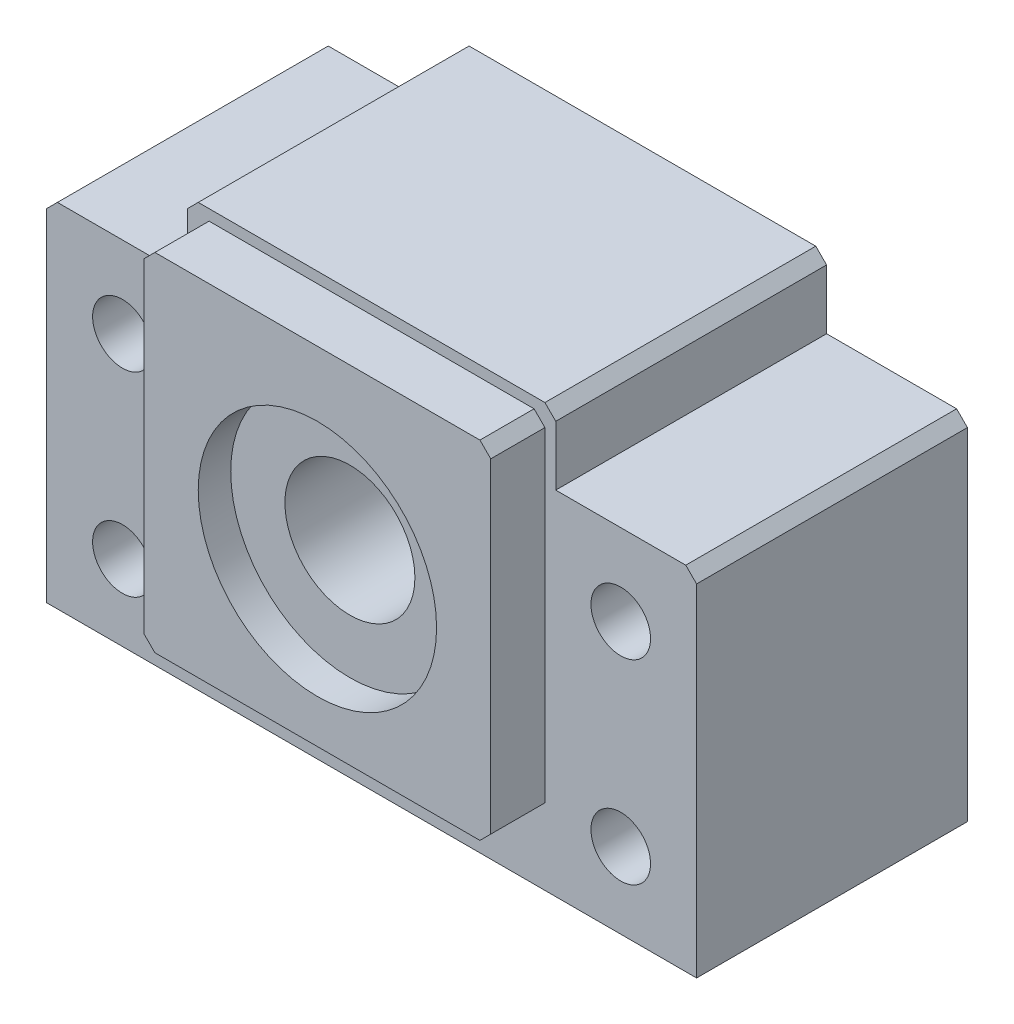
ISO-10303-21;
HEADER;
FILE_DESCRIPTION(('STEP AP214'),'2;1');
FILE_NAME('part.step','',(''),(''),'','','');
FILE_SCHEMA(('AUTOMOTIVE_DESIGN { 1 0 10303 214 1 1 1 1 }'));
ENDSEC;
DATA;
#1=APPLICATION_CONTEXT('core data for automotive mechanical design processes');
#2=APPLICATION_PROTOCOL_DEFINITION('international standard','automotive_design',2000,#1);
#3=PRODUCT_CONTEXT('',#1,'mechanical');
#4=PRODUCT('Part','Part','',(#3));
#5=PRODUCT_RELATED_PRODUCT_CATEGORY('part','',(#4));
#6=PRODUCT_DEFINITION_FORMATION('','',#4);
#7=PRODUCT_DEFINITION_CONTEXT('part definition',#1,'design');
#8=PRODUCT_DEFINITION('design','',#6,#7);
#9=PRODUCT_DEFINITION_SHAPE('','',#8);
#10=(LENGTH_UNIT() NAMED_UNIT(*) SI_UNIT(.MILLI.,.METRE.));
#11=(NAMED_UNIT(*) PLANE_ANGLE_UNIT() SI_UNIT($,.RADIAN.));
#12=(NAMED_UNIT(*) SI_UNIT($,.STERADIAN.) SOLID_ANGLE_UNIT());
#13=UNCERTAINTY_MEASURE_WITH_UNIT(LENGTH_MEASURE(1.E-05),#10,'distance_accuracy_value','');
#14=(GEOMETRIC_REPRESENTATION_CONTEXT(3) GLOBAL_UNCERTAINTY_ASSIGNED_CONTEXT((#13)) GLOBAL_UNIT_ASSIGNED_CONTEXT((#10,
#11,#12)) REPRESENTATION_CONTEXT('',''));
#15=CARTESIAN_POINT('',(0.,0.,0.));
#16=DIRECTION('',(0.,0.,1.));
#17=DIRECTION('',(1.,0.,0.));
#18=AXIS2_PLACEMENT_3D('',#15,#16,#17);
#19=CARTESIAN_POINT('',(0.,4.75,-12.5));
#20=DIRECTION('',(0.,0.,1.));
#21=DIRECTION('',(1.,0.,0.));
#22=AXIS2_PLACEMENT_3D('',#19,#20,#21);
#23=CYLINDRICAL_SURFACE('',#22,6.);
#24=CARTESIAN_POINT('',(0.,4.75,-12.5));
#25=DIRECTION('',(0.,0.,1.));
#26=DIRECTION('',(1.,0.,0.));
#27=AXIS2_PLACEMENT_3D('',#24,#25,#26);
#28=CIRCLE('',#27,6.);
#29=CARTESIAN_POINT('',(6.,4.75,-12.5));
#30=VERTEX_POINT('',#29);
#31=EDGE_CURVE('E649',#30,#30,#28,.T.);
#32=CARTESIAN_POINT('',(0.,4.75,14.5));
#33=DIRECTION('',(0.,0.,1.));
#34=DIRECTION('',(1.,0.,0.));
#35=AXIS2_PLACEMENT_3D('',#32,#33,#34);
#36=CIRCLE('',#35,6.);
#37=CARTESIAN_POINT('',(6.,4.75,14.5));
#38=VERTEX_POINT('',#37);
#39=EDGE_CURVE('E39',#38,#38,#36,.F.);
#40=CARTESIAN_POINT('',(6.,4.75,-12.5));
#41=CARTESIAN_POINT('',(6.,4.75,-12.21875));
#42=CARTESIAN_POINT('',(6.,4.75,-11.9375));
#43=CARTESIAN_POINT('',(6.,4.75,-11.375));
#44=CARTESIAN_POINT('',(6.,4.75,-11.09375));
#45=CARTESIAN_POINT('',(6.,4.75,-10.53125));
#46=CARTESIAN_POINT('',(6.,4.75,-10.25));
#47=CARTESIAN_POINT('',(6.,4.75,-9.6875));
#48=CARTESIAN_POINT('',(6.,4.75,-9.40625));
#49=CARTESIAN_POINT('',(6.,4.75,-8.84375));
#50=CARTESIAN_POINT('',(6.,4.75,-8.5625));
#51=CARTESIAN_POINT('',(6.,4.75,-8.));
#52=CARTESIAN_POINT('',(6.,4.75,-7.71875));
#53=CARTESIAN_POINT('',(6.,4.75,-7.15625));
#54=CARTESIAN_POINT('',(6.,4.75,-6.875));
#55=CARTESIAN_POINT('',(6.,4.75,-6.3125));
#56=CARTESIAN_POINT('',(6.,4.75,-6.03125));
#57=CARTESIAN_POINT('',(6.,4.75,-5.46875));
#58=CARTESIAN_POINT('',(6.,4.75,-5.1875));
#59=CARTESIAN_POINT('',(6.,4.75,-4.625));
#60=CARTESIAN_POINT('',(6.,4.75,-4.34375));
#61=CARTESIAN_POINT('',(6.,4.75,-3.78125));
#62=CARTESIAN_POINT('',(6.,4.75,-3.5));
#63=CARTESIAN_POINT('',(6.,4.75,-2.9375));
#64=CARTESIAN_POINT('',(6.,4.75,-2.65625));
#65=CARTESIAN_POINT('',(6.,4.75,-2.09375));
#66=CARTESIAN_POINT('',(6.,4.75,-1.8125));
#67=CARTESIAN_POINT('',(6.,4.75,-1.25));
#68=CARTESIAN_POINT('',(6.,4.75,-0.968750000000003));
#69=CARTESIAN_POINT('',(6.,4.75,-0.406250000000003));
#70=CARTESIAN_POINT('',(6.,4.75,-0.125000000000003));
#71=CARTESIAN_POINT('',(6.,4.75,0.437499999999997));
#72=CARTESIAN_POINT('',(6.,4.75,0.718749999999997));
#73=CARTESIAN_POINT('',(6.,4.75,1.28125));
#74=CARTESIAN_POINT('',(6.,4.75,1.5625));
#75=CARTESIAN_POINT('',(6.,4.75,2.125));
#76=CARTESIAN_POINT('',(6.,4.75,2.40625));
#77=CARTESIAN_POINT('',(6.,4.75,2.96875));
#78=CARTESIAN_POINT('',(6.,4.75,3.25));
#79=CARTESIAN_POINT('',(6.,4.75,3.8125));
#80=CARTESIAN_POINT('',(6.,4.75,4.09375));
#81=CARTESIAN_POINT('',(6.,4.75,4.65625));
#82=CARTESIAN_POINT('',(6.,4.75,4.9375));
#83=CARTESIAN_POINT('',(6.,4.75,5.5));
#84=CARTESIAN_POINT('',(6.,4.75,5.78125));
#85=CARTESIAN_POINT('',(6.,4.75,6.34375));
#86=CARTESIAN_POINT('',(6.,4.75,6.625));
#87=CARTESIAN_POINT('',(6.,4.75,7.1875));
#88=CARTESIAN_POINT('',(6.,4.75,7.46875));
#89=CARTESIAN_POINT('',(6.,4.75,8.03125));
#90=CARTESIAN_POINT('',(6.,4.75,8.3125));
#91=CARTESIAN_POINT('',(6.,4.75,8.875));
#92=CARTESIAN_POINT('',(6.,4.75,9.15625));
#93=CARTESIAN_POINT('',(6.,4.75,9.71875));
#94=CARTESIAN_POINT('',(6.,4.75,10.));
#95=CARTESIAN_POINT('',(6.,4.75,10.5625));
#96=CARTESIAN_POINT('',(6.,4.75,10.84375));
#97=CARTESIAN_POINT('',(6.,4.75,11.40625));
#98=CARTESIAN_POINT('',(6.,4.75,11.6875));
#99=CARTESIAN_POINT('',(6.,4.75,12.25));
#100=CARTESIAN_POINT('',(6.,4.75,12.53125));
#101=CARTESIAN_POINT('',(6.,4.75,13.09375));
#102=CARTESIAN_POINT('',(6.,4.75,13.375));
#103=CARTESIAN_POINT('',(6.,4.75,13.9375));
#104=CARTESIAN_POINT('',(6.,4.75,14.21875));
#105=CARTESIAN_POINT('',(6.,4.75,14.5));
#106=B_SPLINE_CURVE_WITH_KNOTS('',3,(#40,#41,#42,#43,#44,#45,#46,#47,#48,#49,#50,#51,#52,#53,
#54,#55,#56,#57,#58,#59,#60,#61,#62,#63,#64,#65,#66,#67,#68,#69,#70,#71,#72,#73,#74,#75,#76,#77,
#78,#79,#80,#81,#82,#83,#84,#85,#86,#87,#88,#89,#90,#91,#92,#93,#94,#95,#96,#97,#98,#99,#100,
#101,#102,#103,#104,#105),.UNSPECIFIED.,.F.,.F.,(4,2,2,2,2,2,2,2,2,2,2,2,2,2,2,2,2,2,2,2,2,2,2,
2,2,2,2,2,2,2,2,2,4),(0.,0.843750000000001,1.6875,2.53125,3.375,4.21875,5.0625,5.90625,6.75,
7.59375,8.4375,9.28125,10.125,10.96875,11.8125,12.65625,13.5,14.34375,15.1875,16.03125,16.875,
17.71875,18.5625,19.40625,20.25,21.09375,21.9375,22.78125,23.625,24.46875,25.3125,26.15625,27.),.UNSPECIFIED.);
#107=EDGE_CURVE('BSEAM35',#30,#38,#106,.T.);
#108=ORIENTED_EDGE('',*,*,#31,.F.);
#109=ORIENTED_EDGE('',*,*,#39,.F.);
#110=ORIENTED_EDGE('',*,*,#107,.T.);
#111=ORIENTED_EDGE('',*,*,#107,.F.);
#112=EDGE_LOOP('',(#108,#110,#109,#111));
#113=FACE_BOUND('',#112,.T.);
#114=ADVANCED_FACE('F35',(#113),#23,.F.);
#115=CARTESIAN_POINT('',(0.,0.,12.5));
#116=DIRECTION('',(0.,0.,1.));
#117=DIRECTION('',(1.,0.,0.));
#118=AXIS2_PLACEMENT_3D('',#115,#116,#117);
#119=PLANE('',#118);
#120=CARTESIAN_POINT('',(23.,8.75,12.5));
#121=DIRECTION('',(0.,0.,-1.));
#122=DIRECTION('',(-1.,0.,0.));
#123=AXIS2_PLACEMENT_3D('',#120,#121,#122);
#124=CIRCLE('',#123,2.75);
#125=CARTESIAN_POINT('',(20.25,8.75,12.5));
#126=VERTEX_POINT('',#125);
#127=EDGE_CURVE('E656',#126,#126,#124,.T.);
#128=ORIENTED_EDGE('',*,*,#127,.T.);
#129=EDGE_LOOP('',(#128));
#130=FACE_BOUND('',#129,.T.);
#131=CARTESIAN_POINT('',(-23.,-9.25,12.5));
#132=DIRECTION('',(0.,0.,1.));
#133=DIRECTION('',(1.,0.,0.));
#134=AXIS2_PLACEMENT_3D('',#131,#132,#133);
#135=CIRCLE('',#134,2.75);
#136=CARTESIAN_POINT('',(-20.25,-9.25,12.5));
#137=VERTEX_POINT('',#136);
#138=EDGE_CURVE('E662',#137,#137,#135,.T.);
#139=ORIENTED_EDGE('',*,*,#138,.F.);
#140=EDGE_LOOP('',(#139));
#141=FACE_BOUND('',#140,.T.);
#142=CARTESIAN_POINT('',(-23.,8.75,12.5));
#143=DIRECTION('',(0.,0.,1.));
#144=DIRECTION('',(1.,0.,0.));
#145=AXIS2_PLACEMENT_3D('',#142,#143,#144);
#146=CIRCLE('',#145,2.75);
#147=CARTESIAN_POINT('',(-20.25,8.75,12.5));
#148=VERTEX_POINT('',#147);
#149=EDGE_CURVE('E452',#148,#148,#146,.T.);
#150=ORIENTED_EDGE('',*,*,#149,.F.);
#151=EDGE_LOOP('',(#150));
#152=FACE_BOUND('',#151,.T.);
#153=DIRECTION('',(0.,1.,0.));
#154=VECTOR('',#153,1.);
#155=CARTESIAN_POINT('',(17.,16.25,12.5));
#156=LINE('',#155,#154);
#157=CARTESIAN_POINT('',(17.,16.25,12.5));
#158=VERTEX_POINT('',#157);
#159=CARTESIAN_POINT('',(17.,21.75,12.5));
#160=VERTEX_POINT('',#159);
#161=EDGE_CURVE('E210',#158,#160,#156,.T.);
#162=ORIENTED_EDGE('',*,*,#161,.T.);
#163=DIRECTION('',(0.707106781186548,-0.707106781186548,0.));
#164=VECTOR('',#163,1.);
#165=CARTESIAN_POINT('',(19.375,19.375,12.5));
#166=LINE('',#165,#164);
#167=CARTESIAN_POINT('',(16.,22.75,12.5));
#168=VERTEX_POINT('',#167);
#169=EDGE_CURVE('E44',#160,#168,#166,.F.);
#170=ORIENTED_EDGE('',*,*,#169,.T.);
#171=DIRECTION('',(-1.,0.,0.));
#172=VECTOR('',#171,1.);
#173=CARTESIAN_POINT('',(17.,22.75,12.5));
#174=LINE('',#173,#172);
#175=CARTESIAN_POINT('',(-16.,22.75,12.5));
#176=VERTEX_POINT('',#175);
#177=EDGE_CURVE('E212',#168,#176,#174,.T.);
#178=ORIENTED_EDGE('',*,*,#177,.T.);
#179=DIRECTION('',(0.70710678118655,0.707106781186545,0.));
#180=VECTOR('',#179,1.);
#181=CARTESIAN_POINT('',(-19.3749999999999,19.3750000000001,12.5));
#182=LINE('',#181,#180);
#183=CARTESIAN_POINT('',(-17.,21.75,12.5));
#184=VERTEX_POINT('',#183);
#185=EDGE_CURVE('E51',#176,#184,#182,.F.);
#186=ORIENTED_EDGE('',*,*,#185,.T.);
#187=DIRECTION('',(0.,-1.,0.));
#188=VECTOR('',#187,1.);
#189=CARTESIAN_POINT('',(-17.,22.75,12.5));
#190=LINE('',#189,#188);
#191=CARTESIAN_POINT('',(-17.,16.25,12.5));
#192=VERTEX_POINT('',#191);
#193=EDGE_CURVE('E214',#184,#192,#190,.T.);
#194=ORIENTED_EDGE('',*,*,#193,.T.);
#195=DIRECTION('',(-1.,0.,0.));
#196=VECTOR('',#195,1.);
#197=CARTESIAN_POINT('',(-17.,16.25,12.5));
#198=LINE('',#197,#196);
#199=CARTESIAN_POINT('',(-29.,16.25,12.5));
#200=VERTEX_POINT('',#199);
#201=EDGE_CURVE('E188',#192,#200,#198,.T.);
#202=ORIENTED_EDGE('',*,*,#201,.T.);
#203=DIRECTION('',(0.70710678118655,0.707106781186545,0.));
#204=VECTOR('',#203,1.);
#205=CARTESIAN_POINT('',(-22.6249999999999,22.625,12.5));
#206=LINE('',#205,#204);
#207=CARTESIAN_POINT('',(-30.,15.25,12.5));
#208=VERTEX_POINT('',#207);
#209=EDGE_CURVE('E184',#200,#208,#206,.F.);
#210=ORIENTED_EDGE('',*,*,#209,.T.);
#211=DIRECTION('',(0.,-1.,0.));
#212=VECTOR('',#211,1.);
#213=CARTESIAN_POINT('',(-30.,16.25,12.5));
#214=LINE('',#213,#212);
#215=CARTESIAN_POINT('',(-30.,-16.25,12.5));
#216=VERTEX_POINT('',#215);
#217=EDGE_CURVE('E174',#208,#216,#214,.T.);
#218=ORIENTED_EDGE('',*,*,#217,.T.);
#219=DIRECTION('',(1.,0.,0.));
#220=VECTOR('',#219,1.);
#221=CARTESIAN_POINT('',(-30.,-16.25,12.5));
#222=LINE('',#221,#220);
#223=CARTESIAN_POINT('',(30.,-16.25,12.5));
#224=VERTEX_POINT('',#223);
#225=EDGE_CURVE('E180',#216,#224,#222,.T.);
#226=ORIENTED_EDGE('',*,*,#225,.T.);
#227=DIRECTION('',(0.,1.,0.));
#228=VECTOR('',#227,1.);
#229=CARTESIAN_POINT('',(30.,-16.25,12.5));
#230=LINE('',#229,#228);
#231=CARTESIAN_POINT('',(30.,15.25,12.5));
#232=VERTEX_POINT('',#231);
#233=EDGE_CURVE('E203',#224,#232,#230,.T.);
#234=ORIENTED_EDGE('',*,*,#233,.T.);
#235=DIRECTION('',(0.707106781186545,-0.70710678118655,0.));
#236=VECTOR('',#235,1.);
#237=CARTESIAN_POINT('',(22.6250000000001,22.6249999999999,12.5));
#238=LINE('',#237,#236);
#239=CARTESIAN_POINT('',(29.,16.25,12.5));
#240=VERTEX_POINT('',#239);
#241=EDGE_CURVE('E285',#232,#240,#238,.F.);
#242=ORIENTED_EDGE('',*,*,#241,.T.);
#243=DIRECTION('',(-1.,0.,0.));
#244=VECTOR('',#243,1.);
#245=CARTESIAN_POINT('',(30.,16.25,12.5));
#246=LINE('',#245,#244);
#247=EDGE_CURVE('E205',#240,#158,#246,.T.);
#248=ORIENTED_EDGE('',*,*,#247,.T.);
#249=EDGE_LOOP('',(#162,#170,#178,#186,#194,#202,#210,#218,#226,#234,#242,#248));
#250=FACE_BOUND('',#249,.T.);
#251=DIRECTION('',(1.,0.,0.));
#252=VECTOR('',#251,1.);
#253=CARTESIAN_POINT('',(-16.,-10.25,12.5));
#254=LINE('',#253,#252);
#255=CARTESIAN_POINT('',(-15.,-10.25,12.5));
#256=VERTEX_POINT('',#255);
#257=CARTESIAN_POINT('',(15.,-10.25,12.5));
#258=VERTEX_POINT('',#257);
#259=EDGE_CURVE('E460',#256,#258,#254,.T.);
#260=ORIENTED_EDGE('',*,*,#259,.F.);
#261=DIRECTION('',(0.707106781186545,-0.70710678118655,0.));
#262=VECTOR('',#261,1.);
#263=CARTESIAN_POINT('',(-15.,-10.25,12.5));
#264=LINE('',#263,#262);
#265=CARTESIAN_POINT('',(-16.,-9.25000000000001,12.5));
#266=VERTEX_POINT('',#265);
#267=EDGE_CURVE('E271',#256,#266,#264,.F.);
#268=ORIENTED_EDGE('',*,*,#267,.T.);
#269=DIRECTION('',(0.,-1.,0.));
#270=VECTOR('',#269,1.);
#271=CARTESIAN_POINT('',(-16.,21.75,12.5));
#272=LINE('',#271,#270);
#273=CARTESIAN_POINT('',(-16.,20.75,12.5));
#274=VERTEX_POINT('',#273);
#275=EDGE_CURVE('E458',#274,#266,#272,.T.);
#276=ORIENTED_EDGE('',*,*,#275,.F.);
#277=DIRECTION('',(-0.70710678118655,-0.707106781186545,0.));
#278=VECTOR('',#277,1.);
#279=CARTESIAN_POINT('',(-16.,20.75,12.5));
#280=LINE('',#279,#278);
#281=CARTESIAN_POINT('',(-15.,21.75,12.5));
#282=VERTEX_POINT('',#281);
#283=EDGE_CURVE('E275',#274,#282,#280,.F.);
#284=ORIENTED_EDGE('',*,*,#283,.T.);
#285=DIRECTION('',(-1.,0.,0.));
#286=VECTOR('',#285,1.);
#287=CARTESIAN_POINT('',(-16.,21.75,12.5));
#288=LINE('',#287,#286);
#289=CARTESIAN_POINT('',(15.,21.75,12.5));
#290=VERTEX_POINT('',#289);
#291=EDGE_CURVE('E444',#290,#282,#288,.T.);
#292=ORIENTED_EDGE('',*,*,#291,.F.);
#293=DIRECTION('',(-0.707106781186545,0.70710678118655,0.));
#294=VECTOR('',#293,1.);
#295=CARTESIAN_POINT('',(15.,21.75,12.5));
#296=LINE('',#295,#294);
#297=CARTESIAN_POINT('',(16.,20.75,12.5));
#298=VERTEX_POINT('',#297);
#299=EDGE_CURVE('E273',#290,#298,#296,.F.);
#300=ORIENTED_EDGE('',*,*,#299,.T.);
#301=DIRECTION('',(0.,1.,0.));
#302=VECTOR('',#301,1.);
#303=CARTESIAN_POINT('',(16.,21.75,12.5));
#304=LINE('',#303,#302);
#305=CARTESIAN_POINT('',(16.,-9.25000000000001,12.5));
#306=VERTEX_POINT('',#305);
#307=EDGE_CURVE('E449',#306,#298,#304,.T.);
#308=ORIENTED_EDGE('',*,*,#307,.F.);
#309=DIRECTION('',(0.70710678118655,0.707106781186545,0.));
#310=VECTOR('',#309,1.);
#311=CARTESIAN_POINT('',(16.,-9.25000000000001,12.5));
#312=LINE('',#311,#310);
#313=EDGE_CURVE('E269',#306,#258,#312,.F.);
#314=ORIENTED_EDGE('',*,*,#313,.T.);
#315=EDGE_LOOP('',(#260,#268,#276,#284,#292,#300,#308,#314));
#316=FACE_BOUND('',#315,.T.);
#317=CARTESIAN_POINT('',(23.,-9.25,12.5));
#318=DIRECTION('',(0.,0.,-1.));
#319=DIRECTION('',(-1.,0.,0.));
#320=AXIS2_PLACEMENT_3D('',#317,#318,#319);
#321=CIRCLE('',#320,2.75);
#322=CARTESIAN_POINT('',(20.25,-9.25,12.5));
#323=VERTEX_POINT('',#322);
#324=EDGE_CURVE('E652',#323,#323,#321,.T.);
#325=ORIENTED_EDGE('',*,*,#324,.T.);
#326=EDGE_LOOP('',(#325));
#327=FACE_BOUND('',#326,.T.);
#328=ADVANCED_FACE('F176',(#130,#141,#152,#250,#316,#327),#119,.T.);
#329=CARTESIAN_POINT('',(0.,0.,-12.5));
#330=DIRECTION('',(0.,0.,1.));
#331=DIRECTION('',(1.,0.,0.));
#332=AXIS2_PLACEMENT_3D('',#329,#330,#331);
#333=PLANE('',#332);
#334=ORIENTED_EDGE('',*,*,#31,.T.);
#335=EDGE_LOOP('',(#334));
#336=FACE_BOUND('',#335,.T.);
#337=CARTESIAN_POINT('',(23.,8.75,-12.5));
#338=DIRECTION('',(0.,0.,-1.));
#339=DIRECTION('',(-1.,0.,0.));
#340=AXIS2_PLACEMENT_3D('',#337,#338,#339);
#341=CIRCLE('',#340,2.75);
#342=CARTESIAN_POINT('',(20.25,8.75,-12.5));
#343=VERTEX_POINT('',#342);
#344=EDGE_CURVE('E659',#343,#343,#341,.T.);
#345=ORIENTED_EDGE('',*,*,#344,.F.);
#346=EDGE_LOOP('',(#345));
#347=FACE_BOUND('',#346,.T.);
#348=CARTESIAN_POINT('',(-23.,-9.25,-12.5));
#349=DIRECTION('',(0.,0.,1.));
#350=DIRECTION('',(1.,0.,0.));
#351=AXIS2_PLACEMENT_3D('',#348,#349,#350);
#352=CIRCLE('',#351,2.75);
#353=CARTESIAN_POINT('',(-20.25,-9.25,-12.5));
#354=VERTEX_POINT('',#353);
#355=EDGE_CURVE('E665',#354,#354,#352,.T.);
#356=ORIENTED_EDGE('',*,*,#355,.T.);
#357=EDGE_LOOP('',(#356));
#358=FACE_BOUND('',#357,.T.);
#359=CARTESIAN_POINT('',(-23.,8.75,-12.5));
#360=DIRECTION('',(0.,0.,1.));
#361=DIRECTION('',(1.,0.,0.));
#362=AXIS2_PLACEMENT_3D('',#359,#360,#361);
#363=CIRCLE('',#362,2.75);
#364=CARTESIAN_POINT('',(-20.25,8.75,-12.5));
#365=VERTEX_POINT('',#364);
#366=EDGE_CURVE('E461',#365,#365,#363,.T.);
#367=ORIENTED_EDGE('',*,*,#366,.T.);
#368=EDGE_LOOP('',(#367));
#369=FACE_BOUND('',#368,.T.);
#370=DIRECTION('',(-1.,0.,0.));
#371=VECTOR('',#370,1.);
#372=CARTESIAN_POINT('',(17.,22.75,-12.5));
#373=LINE('',#372,#371);
#374=CARTESIAN_POINT('',(16.,22.75,-12.5));
#375=VERTEX_POINT('',#374);
#376=CARTESIAN_POINT('',(-16.,22.75,-12.5));
#377=VERTEX_POINT('',#376);
#378=EDGE_CURVE('E231',#375,#377,#373,.T.);
#379=ORIENTED_EDGE('',*,*,#378,.F.);
#380=DIRECTION('',(-0.707106781186548,0.707106781186548,0.));
#381=VECTOR('',#380,1.);
#382=CARTESIAN_POINT('',(16.,22.75,-12.5));
#383=LINE('',#382,#381);
#384=CARTESIAN_POINT('',(17.,21.75,-12.5));
#385=VERTEX_POINT('',#384);
#386=EDGE_CURVE('E300',#375,#385,#383,.F.);
#387=ORIENTED_EDGE('',*,*,#386,.T.);
#388=DIRECTION('',(0.,1.,0.));
#389=VECTOR('',#388,1.);
#390=CARTESIAN_POINT('',(17.,16.25,-12.5));
#391=LINE('',#390,#389);
#392=CARTESIAN_POINT('',(17.,16.25,-12.5));
#393=VERTEX_POINT('',#392);
#394=EDGE_CURVE('E229',#393,#385,#391,.T.);
#395=ORIENTED_EDGE('',*,*,#394,.F.);
#396=DIRECTION('',(-1.,0.,0.));
#397=VECTOR('',#396,1.);
#398=CARTESIAN_POINT('',(30.,16.25,-12.5));
#399=LINE('',#398,#397);
#400=CARTESIAN_POINT('',(29.,16.25,-12.5));
#401=VERTEX_POINT('',#400);
#402=EDGE_CURVE('E227',#401,#393,#399,.T.);
#403=ORIENTED_EDGE('',*,*,#402,.F.);
#404=DIRECTION('',(-0.707106781186545,0.70710678118655,0.));
#405=VECTOR('',#404,1.);
#406=CARTESIAN_POINT('',(29.,16.25,-12.5));
#407=LINE('',#406,#405);
#408=CARTESIAN_POINT('',(30.,15.25,-12.5));
#409=VERTEX_POINT('',#408);
#410=EDGE_CURVE('E279',#401,#409,#407,.F.);
#411=ORIENTED_EDGE('',*,*,#410,.T.);
#412=DIRECTION('',(0.,1.,0.));
#413=VECTOR('',#412,1.);
#414=CARTESIAN_POINT('',(30.,-16.25,-12.5));
#415=LINE('',#414,#413);
#416=CARTESIAN_POINT('',(30.,-16.25,-12.5));
#417=VERTEX_POINT('',#416);
#418=EDGE_CURVE('E224',#417,#409,#415,.T.);
#419=ORIENTED_EDGE('',*,*,#418,.F.);
#420=DIRECTION('',(1.,0.,0.));
#421=VECTOR('',#420,1.);
#422=CARTESIAN_POINT('',(-30.,-16.25,-12.5));
#423=LINE('',#422,#421);
#424=CARTESIAN_POINT('',(-30.,-16.25,-12.5));
#425=VERTEX_POINT('',#424);
#426=EDGE_CURVE('E222',#425,#417,#423,.T.);
#427=ORIENTED_EDGE('',*,*,#426,.F.);
#428=DIRECTION('',(0.,-1.,0.));
#429=VECTOR('',#428,1.);
#430=CARTESIAN_POINT('',(-30.,16.25,-12.5));
#431=LINE('',#430,#429);
#432=CARTESIAN_POINT('',(-30.,15.25,-12.5));
#433=VERTEX_POINT('',#432);
#434=EDGE_CURVE('E194',#433,#425,#431,.T.);
#435=ORIENTED_EDGE('',*,*,#434,.F.);
#436=DIRECTION('',(-0.70710678118655,-0.707106781186545,0.));
#437=VECTOR('',#436,1.);
#438=CARTESIAN_POINT('',(-30.,15.25,-12.5));
#439=LINE('',#438,#437);
#440=CARTESIAN_POINT('',(-29.,16.25,-12.5));
#441=VERTEX_POINT('',#440);
#442=EDGE_CURVE('E281',#433,#441,#439,.F.);
#443=ORIENTED_EDGE('',*,*,#442,.T.);
#444=DIRECTION('',(-1.,0.,0.));
#445=VECTOR('',#444,1.);
#446=CARTESIAN_POINT('',(-17.,16.25,-12.5));
#447=LINE('',#446,#445);
#448=CARTESIAN_POINT('',(-17.,16.25,-12.5));
#449=VERTEX_POINT('',#448);
#450=EDGE_CURVE('E217',#449,#441,#447,.T.);
#451=ORIENTED_EDGE('',*,*,#450,.F.);
#452=DIRECTION('',(0.,-1.,0.));
#453=VECTOR('',#452,1.);
#454=CARTESIAN_POINT('',(-17.,22.75,-12.5));
#455=LINE('',#454,#453);
#456=CARTESIAN_POINT('',(-17.,21.75,-12.5));
#457=VERTEX_POINT('',#456);
#458=EDGE_CURVE('E234',#457,#449,#455,.T.);
#459=ORIENTED_EDGE('',*,*,#458,.F.);
#460=DIRECTION('',(-0.70710678118655,-0.707106781186545,0.));
#461=VECTOR('',#460,1.);
#462=CARTESIAN_POINT('',(-17.,21.75,-12.5));
#463=LINE('',#462,#461);
#464=EDGE_CURVE('E298',#457,#377,#463,.F.);
#465=ORIENTED_EDGE('',*,*,#464,.T.);
#466=EDGE_LOOP('',(#379,#387,#395,#403,#411,#419,#427,#435,#443,#451,#459,#465));
#467=FACE_BOUND('',#466,.T.);
#468=CARTESIAN_POINT('',(23.,-9.25,-12.5));
#469=DIRECTION('',(0.,0.,-1.));
#470=DIRECTION('',(-1.,0.,0.));
#471=AXIS2_PLACEMENT_3D('',#468,#469,#470);
#472=CIRCLE('',#471,2.75);
#473=CARTESIAN_POINT('',(20.25,-9.25,-12.5));
#474=VERTEX_POINT('',#473);
#475=EDGE_CURVE('E653',#474,#474,#472,.T.);
#476=ORIENTED_EDGE('',*,*,#475,.F.);
#477=EDGE_LOOP('',(#476));
#478=FACE_BOUND('',#477,.T.);
#479=ADVANCED_FACE('F315',(#336,#347,#358,#369,#467,#478),#333,.F.);
#480=CARTESIAN_POINT('',(-17.,16.25,12.5));
#481=DIRECTION('',(0.,-1.,0.));
#482=DIRECTION('',(1.,0.,0.));
#483=AXIS2_PLACEMENT_3D('',#480,#481,#482);
#484=PLANE('',#483);
#485=ORIENTED_EDGE('',*,*,#450,.T.);
#486=DIRECTION('',(0.,0.,1.));
#487=VECTOR('',#486,1.);
#488=CARTESIAN_POINT('',(-29.,16.25,12.5));
#489=LINE('',#488,#487);
#490=EDGE_CURVE('E283',#441,#200,#489,.T.);
#491=ORIENTED_EDGE('',*,*,#490,.T.);
#492=ORIENTED_EDGE('',*,*,#201,.F.);
#493=DIRECTION('',(0.,0.,-1.));
#494=VECTOR('',#493,1.);
#495=CARTESIAN_POINT('',(-17.,16.25,12.5));
#496=LINE('',#495,#494);
#497=EDGE_CURVE('E216',#192,#449,#496,.T.);
#498=ORIENTED_EDGE('',*,*,#497,.T.);
#499=EDGE_LOOP('',(#485,#491,#492,#498));
#500=FACE_BOUND('',#499,.T.);
#501=ADVANCED_FACE('F394',(#500),#484,.F.);
#502=CARTESIAN_POINT('',(-30.,16.25,12.5));
#503=DIRECTION('',(1.,0.,0.));
#504=DIRECTION('',(0.,1.,0.));
#505=AXIS2_PLACEMENT_3D('',#502,#503,#504);
#506=PLANE('',#505);
#507=ORIENTED_EDGE('',*,*,#217,.F.);
#508=DIRECTION('',(0.,0.,-1.));
#509=VECTOR('',#508,1.);
#510=CARTESIAN_POINT('',(-30.,15.25,12.5));
#511=LINE('',#510,#509);
#512=EDGE_CURVE('E277',#208,#433,#511,.T.);
#513=ORIENTED_EDGE('',*,*,#512,.T.);
#514=ORIENTED_EDGE('',*,*,#434,.T.);
#515=DIRECTION('',(0.,0.,-1.));
#516=VECTOR('',#515,1.);
#517=CARTESIAN_POINT('',(-30.,-16.25,12.5));
#518=LINE('',#517,#516);
#519=EDGE_CURVE('E191',#216,#425,#518,.T.);
#520=ORIENTED_EDGE('',*,*,#519,.F.);
#521=EDGE_LOOP('',(#507,#513,#514,#520));
#522=FACE_BOUND('',#521,.T.);
#523=ADVANCED_FACE('F192',(#522),#506,.F.);
#524=CARTESIAN_POINT('',(-30.,-16.25,12.5));
#525=DIRECTION('',(0.,1.,0.));
#526=DIRECTION('',(-1.,0.,0.));
#527=AXIS2_PLACEMENT_3D('',#524,#525,#526);
#528=PLANE('',#527);
#529=ORIENTED_EDGE('',*,*,#426,.T.);
#530=DIRECTION('',(0.,0.,-1.));
#531=VECTOR('',#530,1.);
#532=CARTESIAN_POINT('',(30.,-16.25,12.5));
#533=LINE('',#532,#531);
#534=EDGE_CURVE('E198',#224,#417,#533,.T.);
#535=ORIENTED_EDGE('',*,*,#534,.F.);
#536=ORIENTED_EDGE('',*,*,#225,.F.);
#537=ORIENTED_EDGE('',*,*,#519,.T.);
#538=EDGE_LOOP('',(#529,#535,#536,#537));
#539=FACE_BOUND('',#538,.T.);
#540=ADVANCED_FACE('F200',(#539),#528,.F.);
#541=CARTESIAN_POINT('',(30.,-16.25,12.5));
#542=DIRECTION('',(-1.,0.,0.));
#543=DIRECTION('',(0.,0.,1.));
#544=AXIS2_PLACEMENT_3D('',#541,#542,#543);
#545=PLANE('',#544);
#546=ORIENTED_EDGE('',*,*,#418,.T.);
#547=DIRECTION('',(0.,0.,1.));
#548=VECTOR('',#547,1.);
#549=CARTESIAN_POINT('',(30.,15.25,12.5));
#550=LINE('',#549,#548);
#551=EDGE_CURVE('E291',#409,#232,#550,.T.);
#552=ORIENTED_EDGE('',*,*,#551,.T.);
#553=ORIENTED_EDGE('',*,*,#233,.F.);
#554=ORIENTED_EDGE('',*,*,#534,.T.);
#555=EDGE_LOOP('',(#546,#552,#553,#554));
#556=FACE_BOUND('',#555,.T.);
#557=ADVANCED_FACE('F328',(#556),#545,.F.);
#558=CARTESIAN_POINT('',(30.,16.25,12.5));
#559=DIRECTION('',(0.,-1.,0.));
#560=DIRECTION('',(0.,0.,-1.));
#561=AXIS2_PLACEMENT_3D('',#558,#559,#560);
#562=PLANE('',#561);
#563=ORIENTED_EDGE('',*,*,#247,.F.);
#564=DIRECTION('',(0.,0.,-1.));
#565=VECTOR('',#564,1.);
#566=CARTESIAN_POINT('',(29.,16.25,12.5));
#567=LINE('',#566,#565);
#568=EDGE_CURVE('E288',#240,#401,#567,.T.);
#569=ORIENTED_EDGE('',*,*,#568,.T.);
#570=ORIENTED_EDGE('',*,*,#402,.T.);
#571=DIRECTION('',(0.,0.,-1.));
#572=VECTOR('',#571,1.);
#573=CARTESIAN_POINT('',(17.,16.25,12.5));
#574=LINE('',#573,#572);
#575=EDGE_CURVE('E238',#158,#393,#574,.T.);
#576=ORIENTED_EDGE('',*,*,#575,.F.);
#577=EDGE_LOOP('',(#563,#569,#570,#576));
#578=FACE_BOUND('',#577,.T.);
#579=ADVANCED_FACE('F322',(#578),#562,.F.);
#580=CARTESIAN_POINT('',(17.,16.25,12.5));
#581=DIRECTION('',(-1.,0.,0.));
#582=DIRECTION('',(0.,0.,1.));
#583=AXIS2_PLACEMENT_3D('',#580,#581,#582);
#584=PLANE('',#583);
#585=ORIENTED_EDGE('',*,*,#394,.T.);
#586=DIRECTION('',(0.,0.,1.));
#587=VECTOR('',#586,1.);
#588=CARTESIAN_POINT('',(17.,21.75,12.5));
#589=LINE('',#588,#587);
#590=EDGE_CURVE('E59',#385,#160,#589,.T.);
#591=ORIENTED_EDGE('',*,*,#590,.T.);
#592=ORIENTED_EDGE('',*,*,#161,.F.);
#593=ORIENTED_EDGE('',*,*,#575,.T.);
#594=EDGE_LOOP('',(#585,#591,#592,#593));
#595=FACE_BOUND('',#594,.T.);
#596=ADVANCED_FACE('F318',(#595),#584,.F.);
#597=CARTESIAN_POINT('',(17.,22.75,12.5));
#598=DIRECTION('',(0.,-1.,0.));
#599=DIRECTION('',(1.,0.,0.));
#600=AXIS2_PLACEMENT_3D('',#597,#598,#599);
#601=PLANE('',#600);
#602=ORIENTED_EDGE('',*,*,#177,.F.);
#603=DIRECTION('',(0.,0.,-1.));
#604=VECTOR('',#603,1.);
#605=CARTESIAN_POINT('',(16.,22.75,12.5));
#606=LINE('',#605,#604);
#607=EDGE_CURVE('E295',#168,#375,#606,.T.);
#608=ORIENTED_EDGE('',*,*,#607,.T.);
#609=ORIENTED_EDGE('',*,*,#378,.T.);
#610=DIRECTION('',(0.,0.,1.));
#611=VECTOR('',#610,1.);
#612=CARTESIAN_POINT('',(-16.,22.75,12.5));
#613=LINE('',#612,#611);
#614=EDGE_CURVE('E293',#377,#176,#613,.T.);
#615=ORIENTED_EDGE('',*,*,#614,.T.);
#616=EDGE_LOOP('',(#602,#608,#609,#615));
#617=FACE_BOUND('',#616,.T.);
#618=ADVANCED_FACE('F309',(#617),#601,.F.);
#619=CARTESIAN_POINT('',(-17.,22.75,12.5));
#620=DIRECTION('',(1.,0.,0.));
#621=DIRECTION('',(0.,0.,-1.));
#622=AXIS2_PLACEMENT_3D('',#619,#620,#621);
#623=PLANE('',#622);
#624=ORIENTED_EDGE('',*,*,#193,.F.);
#625=DIRECTION('',(0.,0.,-1.));
#626=VECTOR('',#625,1.);
#627=CARTESIAN_POINT('',(-17.,21.75,12.5));
#628=LINE('',#627,#626);
#629=EDGE_CURVE('E11',#184,#457,#628,.T.);
#630=ORIENTED_EDGE('',*,*,#629,.T.);
#631=ORIENTED_EDGE('',*,*,#458,.T.);
#632=ORIENTED_EDGE('',*,*,#497,.F.);
#633=EDGE_LOOP('',(#624,#630,#631,#632));
#634=FACE_BOUND('',#633,.T.);
#635=ADVANCED_FACE('F389',(#634),#623,.F.);
#636=CARTESIAN_POINT('',(-16.,21.75,17.5));
#637=DIRECTION('',(1.,0.,0.));
#638=DIRECTION('',(0.,1.,0.));
#639=AXIS2_PLACEMENT_3D('',#636,#637,#638);
#640=PLANE('',#639);
#641=ORIENTED_EDGE('',*,*,#275,.T.);
#642=DIRECTION('',(0.,0.,1.));
#643=VECTOR('',#642,1.);
#644=CARTESIAN_POINT('',(-16.,-9.25000000000001,17.5));
#645=LINE('',#644,#643);
#646=CARTESIAN_POINT('',(-16.,-9.24999999999999,17.5));
#647=VERTEX_POINT('',#646);
#648=EDGE_CURVE('E262',#266,#647,#645,.T.);
#649=ORIENTED_EDGE('',*,*,#648,.T.);
#650=DIRECTION('',(0.,-1.,0.));
#651=VECTOR('',#650,1.);
#652=CARTESIAN_POINT('',(-16.,21.75,17.5));
#653=LINE('',#652,#651);
#654=CARTESIAN_POINT('',(-16.,20.75,17.5));
#655=VERTEX_POINT('',#654);
#656=EDGE_CURVE('E437',#655,#647,#653,.T.);
#657=ORIENTED_EDGE('',*,*,#656,.F.);
#658=DIRECTION('',(0.,0.,-1.));
#659=VECTOR('',#658,1.);
#660=CARTESIAN_POINT('',(-16.,20.75,17.5));
#661=LINE('',#660,#659);
#662=EDGE_CURVE('E259',#655,#274,#661,.T.);
#663=ORIENTED_EDGE('',*,*,#662,.T.);
#664=EDGE_LOOP('',(#641,#649,#657,#663));
#665=FACE_BOUND('',#664,.T.);
#666=ADVANCED_FACE('F386',(#665),#640,.F.);
#667=CARTESIAN_POINT('',(-16.,-10.25,17.5));
#668=DIRECTION('',(0.,1.,0.));
#669=DIRECTION('',(-1.,0.,0.));
#670=AXIS2_PLACEMENT_3D('',#667,#668,#669);
#671=PLANE('',#670);
#672=ORIENTED_EDGE('',*,*,#259,.T.);
#673=DIRECTION('',(0.,0.,1.));
#674=VECTOR('',#673,1.);
#675=CARTESIAN_POINT('',(15.,-10.25,17.5));
#676=LINE('',#675,#674);
#677=CARTESIAN_POINT('',(15.,-10.25,17.5));
#678=VERTEX_POINT('',#677);
#679=EDGE_CURVE('E249',#258,#678,#676,.T.);
#680=ORIENTED_EDGE('',*,*,#679,.T.);
#681=DIRECTION('',(1.,0.,0.));
#682=VECTOR('',#681,1.);
#683=CARTESIAN_POINT('',(-16.,-10.25,17.5));
#684=LINE('',#683,#682);
#685=CARTESIAN_POINT('',(-15.,-10.25,17.5));
#686=VERTEX_POINT('',#685);
#687=EDGE_CURVE('E443',#686,#678,#684,.T.);
#688=ORIENTED_EDGE('',*,*,#687,.F.);
#689=DIRECTION('',(0.,0.,-1.));
#690=VECTOR('',#689,1.);
#691=CARTESIAN_POINT('',(-15.,-10.25,17.5));
#692=LINE('',#691,#690);
#693=EDGE_CURVE('E246',#686,#256,#692,.T.);
#694=ORIENTED_EDGE('',*,*,#693,.T.);
#695=EDGE_LOOP('',(#672,#680,#688,#694));
#696=FACE_BOUND('',#695,.T.);
#697=ADVANCED_FACE('F382',(#696),#671,.F.);
#698=CARTESIAN_POINT('',(16.,21.75,17.5));
#699=DIRECTION('',(-1.,0.,0.));
#700=DIRECTION('',(0.,-1.,0.));
#701=AXIS2_PLACEMENT_3D('',#698,#699,#700);
#702=PLANE('',#701);
#703=DIRECTION('',(0.,1.,0.));
#704=VECTOR('',#703,1.);
#705=CARTESIAN_POINT('',(16.,21.75,17.5));
#706=LINE('',#705,#704);
#707=CARTESIAN_POINT('',(16.,-9.25,17.5));
#708=VERTEX_POINT('',#707);
#709=CARTESIAN_POINT('',(16.,20.75,17.5));
#710=VERTEX_POINT('',#709);
#711=EDGE_CURVE('E446',#708,#710,#706,.T.);
#712=ORIENTED_EDGE('',*,*,#711,.F.);
#713=DIRECTION('',(0.,0.,-1.));
#714=VECTOR('',#713,1.);
#715=CARTESIAN_POINT('',(16.,-9.25000000000001,17.5));
#716=LINE('',#715,#714);
#717=EDGE_CURVE('E243',#708,#306,#716,.T.);
#718=ORIENTED_EDGE('',*,*,#717,.T.);
#719=ORIENTED_EDGE('',*,*,#307,.T.);
#720=DIRECTION('',(0.,0.,1.));
#721=VECTOR('',#720,1.);
#722=CARTESIAN_POINT('',(16.,20.75,17.5));
#723=LINE('',#722,#721);
#724=EDGE_CURVE('E197',#298,#710,#723,.T.);
#725=ORIENTED_EDGE('',*,*,#724,.T.);
#726=EDGE_LOOP('',(#712,#718,#719,#725));
#727=FACE_BOUND('',#726,.T.);
#728=ADVANCED_FACE('F378',(#727),#702,.F.);
#729=CARTESIAN_POINT('',(-16.,21.75,17.5));
#730=DIRECTION('',(0.,-1.,0.));
#731=DIRECTION('',(1.,0.,0.));
#732=AXIS2_PLACEMENT_3D('',#729,#730,#731);
#733=PLANE('',#732);
#734=DIRECTION('',(-1.,0.,0.));
#735=VECTOR('',#734,1.);
#736=CARTESIAN_POINT('',(-16.,21.75,17.5));
#737=LINE('',#736,#735);
#738=CARTESIAN_POINT('',(15.,21.75,17.5));
#739=VERTEX_POINT('',#738);
#740=CARTESIAN_POINT('',(-15.,21.75,17.5));
#741=VERTEX_POINT('',#740);
#742=EDGE_CURVE('E220',#739,#741,#737,.T.);
#743=ORIENTED_EDGE('',*,*,#742,.F.);
#744=DIRECTION('',(0.,0.,-1.));
#745=VECTOR('',#744,1.);
#746=CARTESIAN_POINT('',(15.,21.75,17.5));
#747=LINE('',#746,#745);
#748=EDGE_CURVE('E266',#739,#290,#747,.T.);
#749=ORIENTED_EDGE('',*,*,#748,.T.);
#750=ORIENTED_EDGE('',*,*,#291,.T.);
#751=DIRECTION('',(0.,0.,1.));
#752=VECTOR('',#751,1.);
#753=CARTESIAN_POINT('',(-15.,21.75,17.5));
#754=LINE('',#753,#752);
#755=EDGE_CURVE('E264',#282,#741,#754,.T.);
#756=ORIENTED_EDGE('',*,*,#755,.T.);
#757=EDGE_LOOP('',(#743,#749,#750,#756));
#758=FACE_BOUND('',#757,.T.);
#759=ADVANCED_FACE('F374',(#758),#733,.F.);
#760=CARTESIAN_POINT('',(0.,0.,17.5));
#761=DIRECTION('',(0.,0.,1.));
#762=DIRECTION('',(1.,0.,0.));
#763=AXIS2_PLACEMENT_3D('',#760,#761,#762);
#764=PLANE('',#763);
#765=CARTESIAN_POINT('',(0.,4.75,17.5));
#766=DIRECTION('',(0.,0.,1.));
#767=DIRECTION('',(1.,0.,0.));
#768=AXIS2_PLACEMENT_3D('',#765,#766,#767);
#769=CIRCLE('',#768,11.);
#770=CARTESIAN_POINT('',(11.,4.75,17.5));
#771=VERTEX_POINT('',#770);
#772=EDGE_CURVE('E645',#771,#771,#769,.T.);
#773=ORIENTED_EDGE('',*,*,#772,.F.);
#774=EDGE_LOOP('',(#773));
#775=FACE_BOUND('',#774,.T.);
#776=ORIENTED_EDGE('',*,*,#687,.T.);
#777=DIRECTION('',(-0.70710678118655,-0.707106781186545,0.));
#778=VECTOR('',#777,1.);
#779=CARTESIAN_POINT('',(12.6249999999999,-12.625,17.5));
#780=LINE('',#779,#778);
#781=EDGE_CURVE('E257',#678,#708,#780,.F.);
#782=ORIENTED_EDGE('',*,*,#781,.T.);
#783=ORIENTED_EDGE('',*,*,#711,.T.);
#784=DIRECTION('',(0.707106781186545,-0.70710678118655,0.));
#785=VECTOR('',#784,1.);
#786=CARTESIAN_POINT('',(18.3750000000001,18.3749999999999,17.5));
#787=LINE('',#786,#785);
#788=EDGE_CURVE('E253',#710,#739,#787,.F.);
#789=ORIENTED_EDGE('',*,*,#788,.T.);
#790=ORIENTED_EDGE('',*,*,#742,.T.);
#791=DIRECTION('',(0.70710678118655,0.707106781186545,0.));
#792=VECTOR('',#791,1.);
#793=CARTESIAN_POINT('',(-18.3749999999999,18.3750000000001,17.5));
#794=LINE('',#793,#792);
#795=EDGE_CURVE('E251',#741,#655,#794,.F.);
#796=ORIENTED_EDGE('',*,*,#795,.T.);
#797=ORIENTED_EDGE('',*,*,#656,.T.);
#798=DIRECTION('',(-0.707106781186545,0.70710678118655,0.));
#799=VECTOR('',#798,1.);
#800=CARTESIAN_POINT('',(-12.6250000000001,-12.625,17.5));
#801=LINE('',#800,#799);
#802=EDGE_CURVE('E255',#647,#686,#801,.F.);
#803=ORIENTED_EDGE('',*,*,#802,.T.);
#804=EDGE_LOOP('',(#776,#782,#783,#789,#790,#796,#797,#803));
#805=FACE_BOUND('',#804,.T.);
#806=ADVANCED_FACE('F370',(#775,#805),#764,.T.);
#807=CARTESIAN_POINT('',(16.,-9.25000000000001,17.5));
#808=DIRECTION('',(-0.707106781186545,0.70710678118655,0.));
#809=DIRECTION('',(0.,0.,-1.));
#810=AXIS2_PLACEMENT_3D('',#807,#808,#809);
#811=PLANE('',#810);
#812=ORIENTED_EDGE('',*,*,#781,.F.);
#813=ORIENTED_EDGE('',*,*,#679,.F.);
#814=ORIENTED_EDGE('',*,*,#313,.F.);
#815=ORIENTED_EDGE('',*,*,#717,.F.);
#816=EDGE_LOOP('',(#812,#813,#814,#815));
#817=FACE_BOUND('',#816,.T.);
#818=ADVANCED_FACE('F373',(#817),#811,.F.);
#819=CARTESIAN_POINT('',(-15.,-10.25,17.5));
#820=DIRECTION('',(0.70710678118655,0.707106781186545,0.));
#821=DIRECTION('',(0.,0.,-1.));
#822=AXIS2_PLACEMENT_3D('',#819,#820,#821);
#823=PLANE('',#822);
#824=ORIENTED_EDGE('',*,*,#802,.F.);
#825=ORIENTED_EDGE('',*,*,#648,.F.);
#826=ORIENTED_EDGE('',*,*,#267,.F.);
#827=ORIENTED_EDGE('',*,*,#693,.F.);
#828=EDGE_LOOP('',(#824,#825,#826,#827));
#829=FACE_BOUND('',#828,.T.);
#830=ADVANCED_FACE('F416',(#829),#823,.F.);
#831=CARTESIAN_POINT('',(15.,21.75,17.5));
#832=DIRECTION('',(-0.70710678118655,-0.707106781186545,0.));
#833=DIRECTION('',(0.,0.,-1.));
#834=AXIS2_PLACEMENT_3D('',#831,#832,#833);
#835=PLANE('',#834);
#836=ORIENTED_EDGE('',*,*,#788,.F.);
#837=ORIENTED_EDGE('',*,*,#724,.F.);
#838=ORIENTED_EDGE('',*,*,#299,.F.);
#839=ORIENTED_EDGE('',*,*,#748,.F.);
#840=EDGE_LOOP('',(#836,#837,#838,#839));
#841=FACE_BOUND('',#840,.T.);
#842=ADVANCED_FACE('F420',(#841),#835,.F.);
#843=CARTESIAN_POINT('',(-16.,20.75,17.5));
#844=DIRECTION('',(0.707106781186545,-0.70710678118655,0.));
#845=DIRECTION('',(0.,0.,-1.));
#846=AXIS2_PLACEMENT_3D('',#843,#844,#845);
#847=PLANE('',#846);
#848=ORIENTED_EDGE('',*,*,#795,.F.);
#849=ORIENTED_EDGE('',*,*,#755,.F.);
#850=ORIENTED_EDGE('',*,*,#283,.F.);
#851=ORIENTED_EDGE('',*,*,#662,.F.);
#852=EDGE_LOOP('',(#848,#849,#850,#851));
#853=FACE_BOUND('',#852,.T.);
#854=ADVANCED_FACE('F342',(#853),#847,.F.);
#855=CARTESIAN_POINT('',(-30.,15.25,12.5));
#856=DIRECTION('',(0.707106781186545,-0.70710678118655,0.));
#857=DIRECTION('',(0.,0.,-1.));
#858=AXIS2_PLACEMENT_3D('',#855,#856,#857);
#859=PLANE('',#858);
#860=ORIENTED_EDGE('',*,*,#209,.F.);
#861=ORIENTED_EDGE('',*,*,#490,.F.);
#862=ORIENTED_EDGE('',*,*,#442,.F.);
#863=ORIENTED_EDGE('',*,*,#512,.F.);
#864=EDGE_LOOP('',(#860,#861,#862,#863));
#865=FACE_BOUND('',#864,.T.);
#866=ADVANCED_FACE('F333',(#865),#859,.F.);
#867=CARTESIAN_POINT('',(29.,16.25,12.5));
#868=DIRECTION('',(-0.70710678118655,-0.707106781186545,0.));
#869=DIRECTION('',(0.,0.,-1.));
#870=AXIS2_PLACEMENT_3D('',#867,#868,#869);
#871=PLANE('',#870);
#872=ORIENTED_EDGE('',*,*,#241,.F.);
#873=ORIENTED_EDGE('',*,*,#551,.F.);
#874=ORIENTED_EDGE('',*,*,#410,.F.);
#875=ORIENTED_EDGE('',*,*,#568,.F.);
#876=EDGE_LOOP('',(#872,#873,#874,#875));
#877=FACE_BOUND('',#876,.T.);
#878=ADVANCED_FACE('F330',(#877),#871,.F.);
#879=CARTESIAN_POINT('',(-23.,8.75,-12.5));
#880=DIRECTION('',(0.,0.,1.));
#881=DIRECTION('',(1.,0.,0.));
#882=AXIS2_PLACEMENT_3D('',#879,#880,#881);
#883=CYLINDRICAL_SURFACE('',#882,2.75);
#884=ORIENTED_EDGE('',*,*,#366,.F.);
#885=EDGE_LOOP('',(#884));
#886=FACE_BOUND('',#885,.T.);
#887=ORIENTED_EDGE('',*,*,#149,.T.);
#888=EDGE_LOOP('',(#887));
#889=FACE_BOUND('',#888,.T.);
#890=ADVANCED_FACE('F332',(#886,#889),#883,.F.);
#891=CARTESIAN_POINT('',(-23.,-9.25,-12.5));
#892=DIRECTION('',(0.,0.,1.));
#893=DIRECTION('',(1.,0.,0.));
#894=AXIS2_PLACEMENT_3D('',#891,#892,#893);
#895=CYLINDRICAL_SURFACE('',#894,2.75);
#896=ORIENTED_EDGE('',*,*,#355,.F.);
#897=EDGE_LOOP('',(#896));
#898=FACE_BOUND('',#897,.T.);
#899=ORIENTED_EDGE('',*,*,#138,.T.);
#900=EDGE_LOOP('',(#899));
#901=FACE_BOUND('',#900,.T.);
#902=ADVANCED_FACE('F339',(#898,#901),#895,.F.);
#903=CARTESIAN_POINT('',(23.,8.75,-12.5));
#904=DIRECTION('',(0.,0.,1.));
#905=DIRECTION('',(1.,0.,0.));
#906=AXIS2_PLACEMENT_3D('',#903,#904,#905);
#907=CYLINDRICAL_SURFACE('',#906,2.75);
#908=ORIENTED_EDGE('',*,*,#344,.T.);
#909=EDGE_LOOP('',(#908));
#910=FACE_BOUND('',#909,.T.);
#911=ORIENTED_EDGE('',*,*,#127,.F.);
#912=EDGE_LOOP('',(#911));
#913=FACE_BOUND('',#912,.T.);
#914=ADVANCED_FACE('F362',(#910,#913),#907,.F.);
#915=CARTESIAN_POINT('',(23.,-9.25,-12.5));
#916=DIRECTION('',(0.,0.,1.));
#917=DIRECTION('',(1.,0.,0.));
#918=AXIS2_PLACEMENT_3D('',#915,#916,#917);
#919=CYLINDRICAL_SURFACE('',#918,2.75);
#920=ORIENTED_EDGE('',*,*,#475,.T.);
#921=EDGE_LOOP('',(#920));
#922=FACE_BOUND('',#921,.T.);
#923=ORIENTED_EDGE('',*,*,#324,.F.);
#924=EDGE_LOOP('',(#923));
#925=FACE_BOUND('',#924,.T.);
#926=ADVANCED_FACE('F359',(#922,#925),#919,.F.);
#927=CARTESIAN_POINT('',(16.,22.75,12.5));
#928=DIRECTION('',(-0.707106781186547,-0.707106781186547,0.));
#929=DIRECTION('',(0.,0.,-1.));
#930=AXIS2_PLACEMENT_3D('',#927,#928,#929);
#931=PLANE('',#930);
#932=ORIENTED_EDGE('',*,*,#169,.F.);
#933=ORIENTED_EDGE('',*,*,#590,.F.);
#934=ORIENTED_EDGE('',*,*,#386,.F.);
#935=ORIENTED_EDGE('',*,*,#607,.F.);
#936=EDGE_LOOP('',(#932,#933,#934,#935));
#937=FACE_BOUND('',#936,.T.);
#938=ADVANCED_FACE('F312',(#937),#931,.F.);
#939=CARTESIAN_POINT('',(-17.,21.75,12.5));
#940=DIRECTION('',(0.707106781186545,-0.70710678118655,0.));
#941=DIRECTION('',(0.,0.,-1.));
#942=AXIS2_PLACEMENT_3D('',#939,#940,#941);
#943=PLANE('',#942);
#944=ORIENTED_EDGE('',*,*,#185,.F.);
#945=ORIENTED_EDGE('',*,*,#614,.F.);
#946=ORIENTED_EDGE('',*,*,#464,.F.);
#947=ORIENTED_EDGE('',*,*,#629,.F.);
#948=EDGE_LOOP('',(#944,#945,#946,#947));
#949=FACE_BOUND('',#948,.T.);
#950=ADVANCED_FACE('F37',(#949),#943,.F.);
#951=CARTESIAN_POINT('',(0.,4.75,14.5));
#952=DIRECTION('',(0.,0.,1.));
#953=DIRECTION('',(1.,0.,0.));
#954=AXIS2_PLACEMENT_3D('',#951,#952,#953);
#955=PLANE('',#954);
#956=CARTESIAN_POINT('',(0.,4.75,14.5));
#957=DIRECTION('',(0.,0.,1.));
#958=DIRECTION('',(1.,0.,0.));
#959=AXIS2_PLACEMENT_3D('',#956,#957,#958);
#960=CIRCLE('',#959,11.);
#961=CARTESIAN_POINT('',(11.,4.75,14.5));
#962=VERTEX_POINT('',#961);
#963=EDGE_CURVE('E642',#962,#962,#960,.T.);
#964=ORIENTED_EDGE('',*,*,#963,.T.);
#965=EDGE_LOOP('',(#964));
#966=FACE_BOUND('',#965,.T.);
#967=ORIENTED_EDGE('',*,*,#39,.T.);
#968=EDGE_LOOP('',(#967));
#969=FACE_BOUND('',#968,.T.);
#970=ADVANCED_FACE('F473',(#966,#969),#955,.T.);
#971=CARTESIAN_POINT('',(0.,4.75,14.5));
#972=DIRECTION('',(0.,0.,1.));
#973=DIRECTION('',(1.,0.,0.));
#974=AXIS2_PLACEMENT_3D('',#971,#972,#973);
#975=CYLINDRICAL_SURFACE('',#974,11.);
#976=ORIENTED_EDGE('',*,*,#963,.F.);
#977=EDGE_LOOP('',(#976));
#978=FACE_BOUND('',#977,.T.);
#979=ORIENTED_EDGE('',*,*,#772,.T.);
#980=EDGE_LOOP('',(#979));
#981=FACE_BOUND('',#980,.T.);
#982=ADVANCED_FACE('F357',(#978,#981),#975,.F.);
#983=CLOSED_SHELL('',(#114,#328,#479,#501,#523,#540,#557,#579,#596,#618,#635,#666,#697,#728,
#759,#806,#818,#830,#842,#854,#866,#878,#890,#902,#914,#926,#938,#950,#970,#982));
#984=MANIFOLD_SOLID_BREP('B2',#983);
#985=ADVANCED_BREP_SHAPE_REPRESENTATION('',(#18,#984),#14);
#986=SHAPE_DEFINITION_REPRESENTATION(#9,#985);
ENDSEC;
END-ISO-10303-21;
